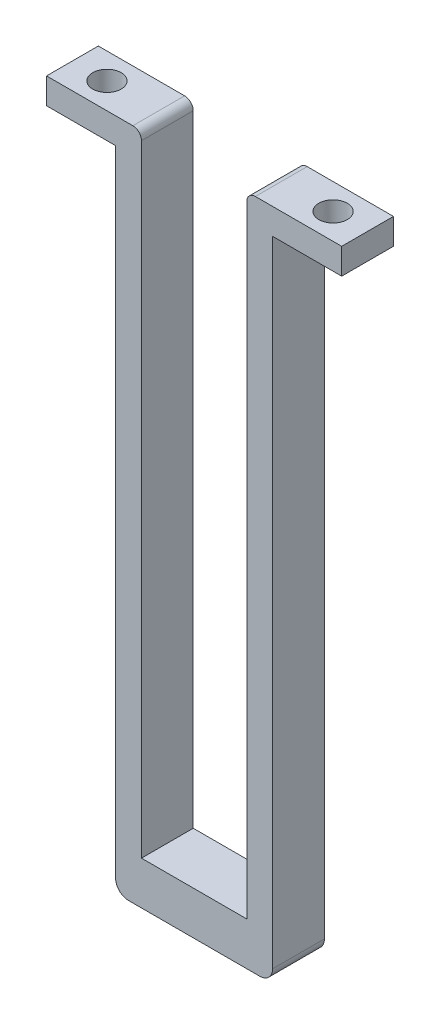
ISO-10303-21;
HEADER;
FILE_DESCRIPTION(('STEP AP214'),'2;1');
FILE_NAME('part.step','',(''),(''),'','','');
FILE_SCHEMA(('AUTOMOTIVE_DESIGN { 1 0 10303 214 1 1 1 1 }'));
ENDSEC;
DATA;
#1=APPLICATION_CONTEXT('core data for automotive mechanical design processes');
#2=APPLICATION_PROTOCOL_DEFINITION('international standard','automotive_design',2000,#1);
#3=PRODUCT_CONTEXT('',#1,'mechanical');
#4=PRODUCT('Part','Part','',(#3));
#5=PRODUCT_RELATED_PRODUCT_CATEGORY('part','',(#4));
#6=PRODUCT_DEFINITION_FORMATION('','',#4);
#7=PRODUCT_DEFINITION_CONTEXT('part definition',#1,'design');
#8=PRODUCT_DEFINITION('design','',#6,#7);
#9=PRODUCT_DEFINITION_SHAPE('','',#8);
#10=(LENGTH_UNIT() NAMED_UNIT(*) SI_UNIT(.MILLI.,.METRE.));
#11=(NAMED_UNIT(*) PLANE_ANGLE_UNIT() SI_UNIT($,.RADIAN.));
#12=(NAMED_UNIT(*) SI_UNIT($,.STERADIAN.) SOLID_ANGLE_UNIT());
#13=UNCERTAINTY_MEASURE_WITH_UNIT(LENGTH_MEASURE(1.E-05),#10,'distance_accuracy_value','');
#14=(GEOMETRIC_REPRESENTATION_CONTEXT(3) GLOBAL_UNCERTAINTY_ASSIGNED_CONTEXT((#13)) GLOBAL_UNIT_ASSIGNED_CONTEXT((#10,
#11,#12)) REPRESENTATION_CONTEXT('',''));
#15=CARTESIAN_POINT('',(0.,0.,0.));
#16=DIRECTION('',(0.,0.,1.));
#17=DIRECTION('',(1.,0.,0.));
#18=AXIS2_PLACEMENT_3D('',#15,#16,#17);
#19=CARTESIAN_POINT('',(6.1,0.,6.));
#20=DIRECTION('',(1.,0.,0.));
#21=DIRECTION('',(0.,0.,-1.));
#22=AXIS2_PLACEMENT_3D('',#19,#20,#21);
#23=PLANE('',#22);
#24=DIRECTION('',(0.,-1.,0.));
#25=VECTOR('',#24,1.);
#26=CARTESIAN_POINT('',(6.1,0.,6.));
#27=LINE('',#26,#25);
#28=CARTESIAN_POINT('',(6.1,72.,6.));
#29=VERTEX_POINT('',#28);
#30=CARTESIAN_POINT('',(6.1,0.,6.));
#31=VERTEX_POINT('',#30);
#32=EDGE_CURVE('E151',#29,#31,#27,.T.);
#33=ORIENTED_EDGE('',*,*,#32,.F.);
#34=DIRECTION('',(0.,0.,-1.));
#35=VECTOR('',#34,1.);
#36=CARTESIAN_POINT('',(6.1,72.,6.));
#37=LINE('',#36,#35);
#38=CARTESIAN_POINT('',(6.1,72.,0.));
#39=VERTEX_POINT('',#38);
#40=EDGE_CURVE('E195',#29,#39,#37,.T.);
#41=ORIENTED_EDGE('',*,*,#40,.T.);
#42=DIRECTION('',(0.,-1.,0.));
#43=VECTOR('',#42,1.);
#44=CARTESIAN_POINT('',(6.1,0.,0.));
#45=LINE('',#44,#43);
#46=CARTESIAN_POINT('',(6.1,0.,0.));
#47=VERTEX_POINT('',#46);
#48=EDGE_CURVE('E176',#39,#47,#45,.T.);
#49=ORIENTED_EDGE('',*,*,#48,.T.);
#50=DIRECTION('',(0.,0.,-1.));
#51=VECTOR('',#50,1.);
#52=CARTESIAN_POINT('',(6.1,0.,6.));
#53=LINE('',#52,#51);
#54=EDGE_CURVE('E169',#31,#47,#53,.T.);
#55=ORIENTED_EDGE('',*,*,#54,.F.);
#56=EDGE_LOOP('',(#33,#41,#49,#55));
#57=FACE_BOUND('',#56,.T.);
#58=ADVANCED_FACE('F37',(#57),#23,.F.);
#59=CARTESIAN_POINT('',(-6.1,0.,6.));
#60=DIRECTION('',(0.,-1.,0.));
#61=DIRECTION('',(0.,0.,-1.));
#62=AXIS2_PLACEMENT_3D('',#59,#60,#61);
#63=PLANE('',#62);
#64=DIRECTION('',(-1.,0.,0.));
#65=VECTOR('',#64,1.);
#66=CARTESIAN_POINT('',(-6.1,0.,0.));
#67=LINE('',#66,#65);
#68=CARTESIAN_POINT('',(-6.1,0.,0.));
#69=VERTEX_POINT('',#68);
#70=EDGE_CURVE('E282',#47,#69,#67,.T.);
#71=ORIENTED_EDGE('',*,*,#70,.T.);
#72=DIRECTION('',(0.,0.,-1.));
#73=VECTOR('',#72,1.);
#74=CARTESIAN_POINT('',(-6.1,0.,6.));
#75=LINE('',#74,#73);
#76=CARTESIAN_POINT('',(-6.1,0.,6.));
#77=VERTEX_POINT('',#76);
#78=EDGE_CURVE('E171',#77,#69,#75,.T.);
#79=ORIENTED_EDGE('',*,*,#78,.F.);
#80=DIRECTION('',(-1.,0.,0.));
#81=VECTOR('',#80,1.);
#82=CARTESIAN_POINT('',(-6.1,0.,6.));
#83=LINE('',#82,#81);
#84=EDGE_CURVE('E155',#31,#77,#83,.T.);
#85=ORIENTED_EDGE('',*,*,#84,.F.);
#86=ORIENTED_EDGE('',*,*,#54,.T.);
#87=EDGE_LOOP('',(#71,#79,#85,#86));
#88=FACE_BOUND('',#87,.T.);
#89=ADVANCED_FACE('F168',(#88),#63,.F.);
#90=CARTESIAN_POINT('',(-6.1,0.,6.));
#91=DIRECTION('',(-1.,0.,0.));
#92=DIRECTION('',(0.,-1.,0.));
#93=AXIS2_PLACEMENT_3D('',#90,#91,#92);
#94=PLANE('',#93);
#95=DIRECTION('',(0.,1.,0.));
#96=VECTOR('',#95,1.);
#97=CARTESIAN_POINT('',(-6.1,0.,0.));
#98=LINE('',#97,#96);
#99=CARTESIAN_POINT('',(-6.10000000000002,72.,0.));
#100=VERTEX_POINT('',#99);
#101=EDGE_CURVE('E277',#69,#100,#98,.T.);
#102=ORIENTED_EDGE('',*,*,#101,.T.);
#103=DIRECTION('',(0.,0.,-1.));
#104=VECTOR('',#103,1.);
#105=CARTESIAN_POINT('',(-6.10000000000002,72.,6.));
#106=LINE('',#105,#104);
#107=CARTESIAN_POINT('',(-6.10000000000002,72.,6.));
#108=VERTEX_POINT('',#107);
#109=EDGE_CURVE('E190',#100,#108,#106,.F.);
#110=ORIENTED_EDGE('',*,*,#109,.T.);
#111=DIRECTION('',(0.,1.,0.));
#112=VECTOR('',#111,1.);
#113=CARTESIAN_POINT('',(-6.1,0.,6.));
#114=LINE('',#113,#112);
#115=EDGE_CURVE('E173',#77,#108,#114,.T.);
#116=ORIENTED_EDGE('',*,*,#115,.F.);
#117=ORIENTED_EDGE('',*,*,#78,.T.);
#118=EDGE_LOOP('',(#102,#110,#116,#117));
#119=FACE_BOUND('',#118,.T.);
#120=ADVANCED_FACE('F330',(#119),#94,.F.);
#121=CARTESIAN_POINT('',(-6.10000000000002,73.,6.));
#122=DIRECTION('',(0.,-1.,0.));
#123=DIRECTION('',(0.,0.,-1.));
#124=AXIS2_PLACEMENT_3D('',#121,#122,#123);
#125=PLANE('',#124);
#126=CARTESIAN_POINT('',(-13.1,73.,3.));
#127=DIRECTION('',(0.,-1.,0.));
#128=DIRECTION('',(0.,0.,-1.));
#129=AXIS2_PLACEMENT_3D('',#126,#127,#128);
#130=CIRCLE('',#129,1.65);
#131=CARTESIAN_POINT('',(-13.1,73.,1.35));
#132=VERTEX_POINT('',#131);
#133=EDGE_CURVE('E285',#132,#132,#130,.F.);
#134=ORIENTED_EDGE('',*,*,#133,.F.);
#135=EDGE_LOOP('',(#134));
#136=FACE_BOUND('',#135,.T.);
#137=DIRECTION('',(-1.,0.,0.));
#138=VECTOR('',#137,1.);
#139=CARTESIAN_POINT('',(-6.10000000000002,73.,6.));
#140=LINE('',#139,#138);
#141=CARTESIAN_POINT('',(-7.10000000000002,73.,6.));
#142=VERTEX_POINT('',#141);
#143=CARTESIAN_POINT('',(-17.1,73.,6.));
#144=VERTEX_POINT('',#143);
#145=EDGE_CURVE('E296',#142,#144,#140,.T.);
#146=ORIENTED_EDGE('',*,*,#145,.F.);
#147=DIRECTION('',(0.,0.,-1.));
#148=VECTOR('',#147,1.);
#149=CARTESIAN_POINT('',(-7.10000000000002,73.,6.));
#150=LINE('',#149,#148);
#151=CARTESIAN_POINT('',(-7.10000000000002,73.,0.));
#152=VERTEX_POINT('',#151);
#153=EDGE_CURVE('E178',#142,#152,#150,.T.);
#154=ORIENTED_EDGE('',*,*,#153,.T.);
#155=DIRECTION('',(-1.,0.,0.));
#156=VECTOR('',#155,1.);
#157=CARTESIAN_POINT('',(-6.10000000000002,73.,0.));
#158=LINE('',#157,#156);
#159=CARTESIAN_POINT('',(-17.1,73.,0.));
#160=VERTEX_POINT('',#159);
#161=EDGE_CURVE('E274',#152,#160,#158,.T.);
#162=ORIENTED_EDGE('',*,*,#161,.T.);
#163=DIRECTION('',(0.,0.,-1.));
#164=VECTOR('',#163,1.);
#165=CARTESIAN_POINT('',(-17.1,73.,6.));
#166=LINE('',#165,#164);
#167=EDGE_CURVE('E183',#144,#160,#166,.T.);
#168=ORIENTED_EDGE('',*,*,#167,.F.);
#169=EDGE_LOOP('',(#146,#154,#162,#168));
#170=FACE_BOUND('',#169,.T.);
#171=ADVANCED_FACE('F324',(#136,#170),#125,.F.);
#172=CARTESIAN_POINT('',(-17.1,73.,6.));
#173=DIRECTION('',(1.,0.,0.));
#174=DIRECTION('',(0.,1.,0.));
#175=AXIS2_PLACEMENT_3D('',#172,#173,#174);
#176=PLANE('',#175);
#177=DIRECTION('',(0.,-1.,0.));
#178=VECTOR('',#177,1.);
#179=CARTESIAN_POINT('',(-17.1,73.,0.));
#180=LINE('',#179,#178);
#181=CARTESIAN_POINT('',(-17.1,70.,0.));
#182=VERTEX_POINT('',#181);
#183=EDGE_CURVE('E268',#160,#182,#180,.T.);
#184=ORIENTED_EDGE('',*,*,#183,.T.);
#185=DIRECTION('',(0.,0.,-1.));
#186=VECTOR('',#185,1.);
#187=CARTESIAN_POINT('',(-17.1,70.,6.));
#188=LINE('',#187,#186);
#189=CARTESIAN_POINT('',(-17.1,70.,6.));
#190=VERTEX_POINT('',#189);
#191=EDGE_CURVE('E259',#190,#182,#188,.T.);
#192=ORIENTED_EDGE('',*,*,#191,.F.);
#193=DIRECTION('',(0.,-1.,0.));
#194=VECTOR('',#193,1.);
#195=CARTESIAN_POINT('',(-17.1,73.,6.));
#196=LINE('',#195,#194);
#197=EDGE_CURVE('E269',#144,#190,#196,.T.);
#198=ORIENTED_EDGE('',*,*,#197,.F.);
#199=ORIENTED_EDGE('',*,*,#167,.T.);
#200=EDGE_LOOP('',(#184,#192,#198,#199));
#201=FACE_BOUND('',#200,.T.);
#202=ADVANCED_FACE('F266',(#201),#176,.F.);
#203=CARTESIAN_POINT('',(-17.1,70.,6.));
#204=DIRECTION('',(0.,1.,0.));
#205=DIRECTION('',(0.,0.,1.));
#206=AXIS2_PLACEMENT_3D('',#203,#204,#205);
#207=PLANE('',#206);
#208=CARTESIAN_POINT('',(-13.1,70.,3.));
#209=DIRECTION('',(0.,-1.,0.));
#210=DIRECTION('',(1.,0.,0.));
#211=AXIS2_PLACEMENT_3D('',#208,#209,#210);
#212=CIRCLE('',#211,1.65);
#213=CARTESIAN_POINT('',(-11.45,70.,3.));
#214=VERTEX_POINT('',#213);
#215=EDGE_CURVE('E302',#214,#214,#212,.T.);
#216=ORIENTED_EDGE('',*,*,#215,.F.);
#217=EDGE_LOOP('',(#216));
#218=FACE_BOUND('',#217,.T.);
#219=DIRECTION('',(1.,0.,0.));
#220=VECTOR('',#219,1.);
#221=CARTESIAN_POINT('',(-17.1,70.,0.));
#222=LINE('',#221,#220);
#223=CARTESIAN_POINT('',(-9.10000000000002,70.,0.));
#224=VERTEX_POINT('',#223);
#225=EDGE_CURVE('E239',#182,#224,#222,.T.);
#226=ORIENTED_EDGE('',*,*,#225,.T.);
#227=DIRECTION('',(0.,0.,-1.));
#228=VECTOR('',#227,1.);
#229=CARTESIAN_POINT('',(-9.10000000000002,70.,6.));
#230=LINE('',#229,#228);
#231=CARTESIAN_POINT('',(-9.10000000000002,70.,6.));
#232=VERTEX_POINT('',#231);
#233=EDGE_CURVE('E256',#232,#224,#230,.T.);
#234=ORIENTED_EDGE('',*,*,#233,.F.);
#235=DIRECTION('',(1.,0.,0.));
#236=VECTOR('',#235,1.);
#237=CARTESIAN_POINT('',(-17.1,70.,6.));
#238=LINE('',#237,#236);
#239=EDGE_CURVE('E293',#190,#232,#238,.T.);
#240=ORIENTED_EDGE('',*,*,#239,.F.);
#241=ORIENTED_EDGE('',*,*,#191,.T.);
#242=EDGE_LOOP('',(#226,#234,#240,#241));
#243=FACE_BOUND('',#242,.T.);
#244=ADVANCED_FACE('F313',(#218,#243),#207,.F.);
#245=CARTESIAN_POINT('',(-9.10000000000002,70.,6.));
#246=DIRECTION('',(1.,0.,0.));
#247=DIRECTION('',(0.,1.,0.));
#248=AXIS2_PLACEMENT_3D('',#245,#246,#247);
#249=PLANE('',#248);
#250=DIRECTION('',(0.,-1.,0.));
#251=VECTOR('',#250,1.);
#252=CARTESIAN_POINT('',(-9.10000000000002,70.,0.));
#253=LINE('',#252,#251);
#254=CARTESIAN_POINT('',(-9.1,-3.5,0.));
#255=VERTEX_POINT('',#254);
#256=EDGE_CURVE('E235',#224,#255,#253,.T.);
#257=ORIENTED_EDGE('',*,*,#256,.T.);
#258=DIRECTION('',(0.,0.,-1.));
#259=VECTOR('',#258,1.);
#260=CARTESIAN_POINT('',(-9.1,-3.5,6.));
#261=LINE('',#260,#259);
#262=CARTESIAN_POINT('',(-9.1,-3.5,6.));
#263=VERTEX_POINT('',#262);
#264=EDGE_CURVE('E11',#255,#263,#261,.F.);
#265=ORIENTED_EDGE('',*,*,#264,.T.);
#266=DIRECTION('',(0.,-1.,0.));
#267=VECTOR('',#266,1.);
#268=CARTESIAN_POINT('',(-9.10000000000002,70.,6.));
#269=LINE('',#268,#267);
#270=EDGE_CURVE('E291',#232,#263,#269,.T.);
#271=ORIENTED_EDGE('',*,*,#270,.F.);
#272=ORIENTED_EDGE('',*,*,#233,.T.);
#273=EDGE_LOOP('',(#257,#265,#271,#272));
#274=FACE_BOUND('',#273,.T.);
#275=ADVANCED_FACE('F316',(#274),#249,.F.);
#276=CARTESIAN_POINT('',(9.1,-5.,6.));
#277=DIRECTION('',(0.,1.,0.));
#278=DIRECTION('',(-1.,0.,0.));
#279=AXIS2_PLACEMENT_3D('',#276,#277,#278);
#280=PLANE('',#279);
#281=DIRECTION('',(1.,0.,0.));
#282=VECTOR('',#281,1.);
#283=CARTESIAN_POINT('',(9.1,-5.,0.));
#284=LINE('',#283,#282);
#285=CARTESIAN_POINT('',(-7.6,-5.,0.));
#286=VERTEX_POINT('',#285);
#287=CARTESIAN_POINT('',(7.6,-5.,0.));
#288=VERTEX_POINT('',#287);
#289=EDGE_CURVE('E230',#286,#288,#284,.T.);
#290=ORIENTED_EDGE('',*,*,#289,.T.);
#291=DIRECTION('',(0.,0.,-1.));
#292=VECTOR('',#291,1.);
#293=CARTESIAN_POINT('',(7.6,-5.,6.));
#294=LINE('',#293,#292);
#295=CARTESIAN_POINT('',(7.6,-5.,6.));
#296=VERTEX_POINT('',#295);
#297=EDGE_CURVE('E58',#288,#296,#294,.F.);
#298=ORIENTED_EDGE('',*,*,#297,.T.);
#299=DIRECTION('',(1.,0.,0.));
#300=VECTOR('',#299,1.);
#301=CARTESIAN_POINT('',(9.1,-5.,6.));
#302=LINE('',#301,#300);
#303=CARTESIAN_POINT('',(-7.6,-5.,6.));
#304=VERTEX_POINT('',#303);
#305=EDGE_CURVE('E215',#304,#296,#302,.T.);
#306=ORIENTED_EDGE('',*,*,#305,.F.);
#307=DIRECTION('',(0.,0.,-1.));
#308=VECTOR('',#307,1.);
#309=CARTESIAN_POINT('',(-7.6,-5.,6.));
#310=LINE('',#309,#308);
#311=EDGE_CURVE('E206',#304,#286,#310,.T.);
#312=ORIENTED_EDGE('',*,*,#311,.T.);
#313=EDGE_LOOP('',(#290,#298,#306,#312));
#314=FACE_BOUND('',#313,.T.);
#315=ADVANCED_FACE('F233',(#314),#280,.F.);
#316=CARTESIAN_POINT('',(9.1,70.,6.));
#317=DIRECTION('',(-1.,0.,0.));
#318=DIRECTION('',(0.,-1.,0.));
#319=AXIS2_PLACEMENT_3D('',#316,#317,#318);
#320=PLANE('',#319);
#321=DIRECTION('',(0.,1.,0.));
#322=VECTOR('',#321,1.);
#323=CARTESIAN_POINT('',(9.1,70.,6.));
#324=LINE('',#323,#322);
#325=CARTESIAN_POINT('',(9.1,-3.5,6.));
#326=VERTEX_POINT('',#325);
#327=CARTESIAN_POINT('',(9.1,70.,6.));
#328=VERTEX_POINT('',#327);
#329=EDGE_CURVE('E213',#326,#328,#324,.T.);
#330=ORIENTED_EDGE('',*,*,#329,.F.);
#331=DIRECTION('',(0.,0.,-1.));
#332=VECTOR('',#331,1.);
#333=CARTESIAN_POINT('',(9.1,-3.5,6.));
#334=LINE('',#333,#332);
#335=CARTESIAN_POINT('',(9.1,-3.5,0.));
#336=VERTEX_POINT('',#335);
#337=EDGE_CURVE('E199',#326,#336,#334,.T.);
#338=ORIENTED_EDGE('',*,*,#337,.T.);
#339=DIRECTION('',(0.,1.,0.));
#340=VECTOR('',#339,1.);
#341=CARTESIAN_POINT('',(9.1,70.,0.));
#342=LINE('',#341,#340);
#343=CARTESIAN_POINT('',(9.1,70.,0.));
#344=VERTEX_POINT('',#343);
#345=EDGE_CURVE('E232',#336,#344,#342,.T.);
#346=ORIENTED_EDGE('',*,*,#345,.T.);
#347=DIRECTION('',(0.,0.,-1.));
#348=VECTOR('',#347,1.);
#349=CARTESIAN_POINT('',(9.1,70.,6.));
#350=LINE('',#349,#348);
#351=EDGE_CURVE('E222',#328,#344,#350,.T.);
#352=ORIENTED_EDGE('',*,*,#351,.F.);
#353=EDGE_LOOP('',(#330,#338,#346,#352));
#354=FACE_BOUND('',#353,.T.);
#355=ADVANCED_FACE('F219',(#354),#320,.F.);
#356=CARTESIAN_POINT('',(17.1,70.,6.));
#357=DIRECTION('',(0.,1.,0.));
#358=DIRECTION('',(0.,0.,1.));
#359=AXIS2_PLACEMENT_3D('',#356,#357,#358);
#360=PLANE('',#359);
#361=CARTESIAN_POINT('',(13.1,70.,3.));
#362=DIRECTION('',(0.,-1.,0.));
#363=DIRECTION('',(1.,0.,0.));
#364=AXIS2_PLACEMENT_3D('',#361,#362,#363);
#365=CIRCLE('',#364,1.65);
#366=CARTESIAN_POINT('',(14.75,70.,3.));
#367=VERTEX_POINT('',#366);
#368=EDGE_CURVE('E303',#367,#367,#365,.T.);
#369=ORIENTED_EDGE('',*,*,#368,.F.);
#370=EDGE_LOOP('',(#369));
#371=FACE_BOUND('',#370,.T.);
#372=DIRECTION('',(1.,0.,0.));
#373=VECTOR('',#372,1.);
#374=CARTESIAN_POINT('',(17.1,70.,0.));
#375=LINE('',#374,#373);
#376=CARTESIAN_POINT('',(17.1,70.,0.));
#377=VERTEX_POINT('',#376);
#378=EDGE_CURVE('E237',#344,#377,#375,.T.);
#379=ORIENTED_EDGE('',*,*,#378,.T.);
#380=DIRECTION('',(0.,0.,-1.));
#381=VECTOR('',#380,1.);
#382=CARTESIAN_POINT('',(17.1,70.,6.));
#383=LINE('',#382,#381);
#384=CARTESIAN_POINT('',(17.1,70.,6.));
#385=VERTEX_POINT('',#384);
#386=EDGE_CURVE('E251',#385,#377,#383,.T.);
#387=ORIENTED_EDGE('',*,*,#386,.F.);
#388=DIRECTION('',(1.,0.,0.));
#389=VECTOR('',#388,1.);
#390=CARTESIAN_POINT('',(17.1,70.,6.));
#391=LINE('',#390,#389);
#392=EDGE_CURVE('E224',#328,#385,#391,.T.);
#393=ORIENTED_EDGE('',*,*,#392,.F.);
#394=ORIENTED_EDGE('',*,*,#351,.T.);
#395=EDGE_LOOP('',(#379,#387,#393,#394));
#396=FACE_BOUND('',#395,.T.);
#397=ADVANCED_FACE('F392',(#371,#396),#360,.F.);
#398=CARTESIAN_POINT('',(17.1,73.,6.));
#399=DIRECTION('',(-1.,0.,0.));
#400=DIRECTION('',(0.,-1.,0.));
#401=AXIS2_PLACEMENT_3D('',#398,#399,#400);
#402=PLANE('',#401);
#403=DIRECTION('',(0.,1.,0.));
#404=VECTOR('',#403,1.);
#405=CARTESIAN_POINT('',(17.1,73.,0.));
#406=LINE('',#405,#404);
#407=CARTESIAN_POINT('',(17.1,73.,0.));
#408=VERTEX_POINT('',#407);
#409=EDGE_CURVE('E244',#377,#408,#406,.T.);
#410=ORIENTED_EDGE('',*,*,#409,.T.);
#411=DIRECTION('',(0.,0.,-1.));
#412=VECTOR('',#411,1.);
#413=CARTESIAN_POINT('',(17.1,73.,6.));
#414=LINE('',#413,#412);
#415=CARTESIAN_POINT('',(17.1,73.,6.));
#416=VERTEX_POINT('',#415);
#417=EDGE_CURVE('E248',#416,#408,#414,.T.);
#418=ORIENTED_EDGE('',*,*,#417,.F.);
#419=DIRECTION('',(0.,1.,0.));
#420=VECTOR('',#419,1.);
#421=CARTESIAN_POINT('',(17.1,73.,6.));
#422=LINE('',#421,#420);
#423=EDGE_CURVE('E287',#385,#416,#422,.T.);
#424=ORIENTED_EDGE('',*,*,#423,.F.);
#425=ORIENTED_EDGE('',*,*,#386,.T.);
#426=EDGE_LOOP('',(#410,#418,#424,#425));
#427=FACE_BOUND('',#426,.T.);
#428=ADVANCED_FACE('F431',(#427),#402,.F.);
#429=CARTESIAN_POINT('',(6.1,73.,6.));
#430=DIRECTION('',(0.,-1.,0.));
#431=DIRECTION('',(0.,0.,-1.));
#432=AXIS2_PLACEMENT_3D('',#429,#430,#431);
#433=PLANE('',#432);
#434=CARTESIAN_POINT('',(13.1,73.,3.));
#435=DIRECTION('',(0.,-1.,0.));
#436=DIRECTION('',(0.,0.,-1.));
#437=AXIS2_PLACEMENT_3D('',#434,#435,#436);
#438=CIRCLE('',#437,1.65);
#439=CARTESIAN_POINT('',(13.1,73.,1.35));
#440=VERTEX_POINT('',#439);
#441=EDGE_CURVE('E299',#440,#440,#438,.F.);
#442=ORIENTED_EDGE('',*,*,#441,.F.);
#443=EDGE_LOOP('',(#442));
#444=FACE_BOUND('',#443,.T.);
#445=DIRECTION('',(-1.,0.,0.));
#446=VECTOR('',#445,1.);
#447=CARTESIAN_POINT('',(6.1,73.,0.));
#448=LINE('',#447,#446);
#449=CARTESIAN_POINT('',(7.1,73.,0.));
#450=VERTEX_POINT('',#449);
#451=EDGE_CURVE('E164',#408,#450,#448,.T.);
#452=ORIENTED_EDGE('',*,*,#451,.T.);
#453=DIRECTION('',(0.,0.,-1.));
#454=VECTOR('',#453,1.);
#455=CARTESIAN_POINT('',(7.1,73.,6.));
#456=LINE('',#455,#454);
#457=CARTESIAN_POINT('',(7.1,73.,6.));
#458=VERTEX_POINT('',#457);
#459=EDGE_CURVE('E197',#450,#458,#456,.F.);
#460=ORIENTED_EDGE('',*,*,#459,.T.);
#461=DIRECTION('',(-1.,0.,0.));
#462=VECTOR('',#461,1.);
#463=CARTESIAN_POINT('',(6.1,73.,6.));
#464=LINE('',#463,#462);
#465=EDGE_CURVE('E252',#416,#458,#464,.T.);
#466=ORIENTED_EDGE('',*,*,#465,.F.);
#467=ORIENTED_EDGE('',*,*,#417,.T.);
#468=EDGE_LOOP('',(#452,#460,#466,#467));
#469=FACE_BOUND('',#468,.T.);
#470=ADVANCED_FACE('F381',(#444,#469),#433,.F.);
#471=CARTESIAN_POINT('',(0.,0.,6.));
#472=DIRECTION('',(0.,0.,-1.));
#473=DIRECTION('',(-1.,0.,0.));
#474=AXIS2_PLACEMENT_3D('',#471,#472,#473);
#475=PLANE('',#474);
#476=ORIENTED_EDGE('',*,*,#305,.T.);
#477=CARTESIAN_POINT('',(7.6,-3.5,6.));
#478=DIRECTION('',(0.,0.,-1.));
#479=DIRECTION('',(-1.,0.,0.));
#480=AXIS2_PLACEMENT_3D('',#477,#478,#479);
#481=CIRCLE('',#480,1.5);
#482=EDGE_CURVE('E45',#296,#326,#481,.F.);
#483=ORIENTED_EDGE('',*,*,#482,.T.);
#484=ORIENTED_EDGE('',*,*,#329,.T.);
#485=ORIENTED_EDGE('',*,*,#392,.T.);
#486=ORIENTED_EDGE('',*,*,#423,.T.);
#487=ORIENTED_EDGE('',*,*,#465,.T.);
#488=CARTESIAN_POINT('',(7.1,72.,6.));
#489=DIRECTION('',(0.,0.,-1.));
#490=DIRECTION('',(-1.,0.,0.));
#491=AXIS2_PLACEMENT_3D('',#488,#489,#490);
#492=CIRCLE('',#491,1.);
#493=EDGE_CURVE('E159',#458,#29,#492,.F.);
#494=ORIENTED_EDGE('',*,*,#493,.T.);
#495=ORIENTED_EDGE('',*,*,#32,.T.);
#496=ORIENTED_EDGE('',*,*,#84,.T.);
#497=ORIENTED_EDGE('',*,*,#115,.T.);
#498=CARTESIAN_POINT('',(-7.10000000000002,72.,6.));
#499=DIRECTION('',(0.,0.,-1.));
#500=DIRECTION('',(-1.,0.,0.));
#501=AXIS2_PLACEMENT_3D('',#498,#499,#500);
#502=CIRCLE('',#501,1.);
#503=EDGE_CURVE('E193',#108,#142,#502,.F.);
#504=ORIENTED_EDGE('',*,*,#503,.T.);
#505=ORIENTED_EDGE('',*,*,#145,.T.);
#506=ORIENTED_EDGE('',*,*,#197,.T.);
#507=ORIENTED_EDGE('',*,*,#239,.T.);
#508=ORIENTED_EDGE('',*,*,#270,.T.);
#509=CARTESIAN_POINT('',(-7.6,-3.5,6.));
#510=DIRECTION('',(0.,0.,-1.));
#511=DIRECTION('',(-1.,0.,0.));
#512=AXIS2_PLACEMENT_3D('',#509,#510,#511);
#513=CIRCLE('',#512,1.5);
#514=EDGE_CURVE('E210',#263,#304,#513,.F.);
#515=ORIENTED_EDGE('',*,*,#514,.T.);
#516=EDGE_LOOP('',(#476,#483,#484,#485,#486,#487,#494,#495,#496,#497,#504,#505,#506,#507,#508,#515));
#517=FACE_BOUND('',#516,.T.);
#518=ADVANCED_FACE('F153',(#517),#475,.F.);
#519=CARTESIAN_POINT('',(0.,0.,0.));
#520=DIRECTION('',(0.,0.,-1.));
#521=DIRECTION('',(-1.,0.,0.));
#522=AXIS2_PLACEMENT_3D('',#519,#520,#521);
#523=PLANE('',#522);
#524=ORIENTED_EDGE('',*,*,#345,.F.);
#525=CARTESIAN_POINT('',(7.6,-3.5,0.));
#526=DIRECTION('',(0.,0.,-1.));
#527=DIRECTION('',(-1.,0.,0.));
#528=AXIS2_PLACEMENT_3D('',#525,#526,#527);
#529=CIRCLE('',#528,1.5);
#530=EDGE_CURVE('E204',#336,#288,#529,.T.);
#531=ORIENTED_EDGE('',*,*,#530,.T.);
#532=ORIENTED_EDGE('',*,*,#289,.F.);
#533=CARTESIAN_POINT('',(-7.6,-3.5,0.));
#534=DIRECTION('',(0.,0.,-1.));
#535=DIRECTION('',(-1.,0.,0.));
#536=AXIS2_PLACEMENT_3D('',#533,#534,#535);
#537=CIRCLE('',#536,1.5);
#538=EDGE_CURVE('E202',#286,#255,#537,.T.);
#539=ORIENTED_EDGE('',*,*,#538,.T.);
#540=ORIENTED_EDGE('',*,*,#256,.F.);
#541=ORIENTED_EDGE('',*,*,#225,.F.);
#542=ORIENTED_EDGE('',*,*,#183,.F.);
#543=ORIENTED_EDGE('',*,*,#161,.F.);
#544=CARTESIAN_POINT('',(-7.10000000000002,72.,0.));
#545=DIRECTION('',(0.,0.,-1.));
#546=DIRECTION('',(-1.,0.,0.));
#547=AXIS2_PLACEMENT_3D('',#544,#545,#546);
#548=CIRCLE('',#547,1.);
#549=EDGE_CURVE('E188',#152,#100,#548,.T.);
#550=ORIENTED_EDGE('',*,*,#549,.T.);
#551=ORIENTED_EDGE('',*,*,#101,.F.);
#552=ORIENTED_EDGE('',*,*,#70,.F.);
#553=ORIENTED_EDGE('',*,*,#48,.F.);
#554=CARTESIAN_POINT('',(7.1,72.,0.));
#555=DIRECTION('',(0.,0.,-1.));
#556=DIRECTION('',(-1.,0.,0.));
#557=AXIS2_PLACEMENT_3D('',#554,#555,#556);
#558=CIRCLE('',#557,1.);
#559=EDGE_CURVE('E181',#39,#450,#558,.T.);
#560=ORIENTED_EDGE('',*,*,#559,.T.);
#561=ORIENTED_EDGE('',*,*,#451,.F.);
#562=ORIENTED_EDGE('',*,*,#409,.F.);
#563=ORIENTED_EDGE('',*,*,#378,.F.);
#564=EDGE_LOOP('',(#524,#531,#532,#539,#540,#541,#542,#543,#550,#551,#552,#553,#560,#561,#562,#563));
#565=FACE_BOUND('',#564,.T.);
#566=ADVANCED_FACE('F229',(#565),#523,.T.);
#567=CARTESIAN_POINT('',(13.1,77.6669047558312,3.));
#568=DIRECTION('',(0.,-1.,0.));
#569=DIRECTION('',(1.,0.,0.));
#570=AXIS2_PLACEMENT_3D('',#567,#568,#569);
#571=CYLINDRICAL_SURFACE('',#570,1.65);
#572=ORIENTED_EDGE('',*,*,#441,.T.);
#573=EDGE_LOOP('',(#572));
#574=FACE_BOUND('',#573,.T.);
#575=ORIENTED_EDGE('',*,*,#368,.T.);
#576=EDGE_LOOP('',(#575));
#577=FACE_BOUND('',#576,.T.);
#578=ADVANCED_FACE('F370',(#574,#577),#571,.F.);
#579=CARTESIAN_POINT('',(-13.1,77.6669047558312,3.));
#580=DIRECTION('',(0.,-1.,0.));
#581=DIRECTION('',(1.,0.,0.));
#582=AXIS2_PLACEMENT_3D('',#579,#580,#581);
#583=CYLINDRICAL_SURFACE('',#582,1.65);
#584=ORIENTED_EDGE('',*,*,#133,.T.);
#585=EDGE_LOOP('',(#584));
#586=FACE_BOUND('',#585,.T.);
#587=ORIENTED_EDGE('',*,*,#215,.T.);
#588=EDGE_LOOP('',(#587));
#589=FACE_BOUND('',#588,.T.);
#590=ADVANCED_FACE('F311',(#586,#589),#583,.F.);
#591=CARTESIAN_POINT('',(-7.10000000000002,72.,6.));
#592=DIRECTION('',(0.,0.,-1.));
#593=DIRECTION('',(-1.,0.,0.));
#594=AXIS2_PLACEMENT_3D('',#591,#592,#593);
#595=CYLINDRICAL_SURFACE('',#594,1.);
#596=ORIENTED_EDGE('',*,*,#503,.F.);
#597=ORIENTED_EDGE('',*,*,#109,.F.);
#598=ORIENTED_EDGE('',*,*,#549,.F.);
#599=ORIENTED_EDGE('',*,*,#153,.F.);
#600=EDGE_LOOP('',(#596,#597,#598,#599));
#601=FACE_BOUND('',#600,.T.);
#602=ADVANCED_FACE('F326',(#601),#595,.T.);
#603=CARTESIAN_POINT('',(7.1,72.,6.));
#604=DIRECTION('',(0.,0.,-1.));
#605=DIRECTION('',(-1.,0.,0.));
#606=AXIS2_PLACEMENT_3D('',#603,#604,#605);
#607=CYLINDRICAL_SURFACE('',#606,1.);
#608=ORIENTED_EDGE('',*,*,#493,.F.);
#609=ORIENTED_EDGE('',*,*,#459,.F.);
#610=ORIENTED_EDGE('',*,*,#559,.F.);
#611=ORIENTED_EDGE('',*,*,#40,.F.);
#612=EDGE_LOOP('',(#608,#609,#610,#611));
#613=FACE_BOUND('',#612,.T.);
#614=ADVANCED_FACE('F347',(#613),#607,.T.);
#615=CARTESIAN_POINT('',(7.6,-3.5,6.));
#616=DIRECTION('',(0.,0.,-1.));
#617=DIRECTION('',(-1.,0.,0.));
#618=AXIS2_PLACEMENT_3D('',#615,#616,#617);
#619=CYLINDRICAL_SURFACE('',#618,1.5);
#620=ORIENTED_EDGE('',*,*,#482,.F.);
#621=ORIENTED_EDGE('',*,*,#297,.F.);
#622=ORIENTED_EDGE('',*,*,#530,.F.);
#623=ORIENTED_EDGE('',*,*,#337,.F.);
#624=EDGE_LOOP('',(#620,#621,#622,#623));
#625=FACE_BOUND('',#624,.T.);
#626=ADVANCED_FACE('F226',(#625),#619,.T.);
#627=CARTESIAN_POINT('',(-7.6,-3.5,6.));
#628=DIRECTION('',(0.,0.,-1.));
#629=DIRECTION('',(-1.,0.,0.));
#630=AXIS2_PLACEMENT_3D('',#627,#628,#629);
#631=CYLINDRICAL_SURFACE('',#630,1.5);
#632=ORIENTED_EDGE('',*,*,#514,.F.);
#633=ORIENTED_EDGE('',*,*,#264,.F.);
#634=ORIENTED_EDGE('',*,*,#538,.F.);
#635=ORIENTED_EDGE('',*,*,#311,.F.);
#636=EDGE_LOOP('',(#632,#633,#634,#635));
#637=FACE_BOUND('',#636,.T.);
#638=ADVANCED_FACE('F39',(#637),#631,.T.);
#639=CLOSED_SHELL('',(#58,#89,#120,#171,#202,#244,#275,#315,#355,#397,#428,#470,#518,#566,#578,
#590,#602,#614,#626,#638));
#640=MANIFOLD_SOLID_BREP('B2',#639);
#641=ADVANCED_BREP_SHAPE_REPRESENTATION('',(#18,#640),#14);
#642=SHAPE_DEFINITION_REPRESENTATION(#9,#641);
ENDSEC;
END-ISO-10303-21;
